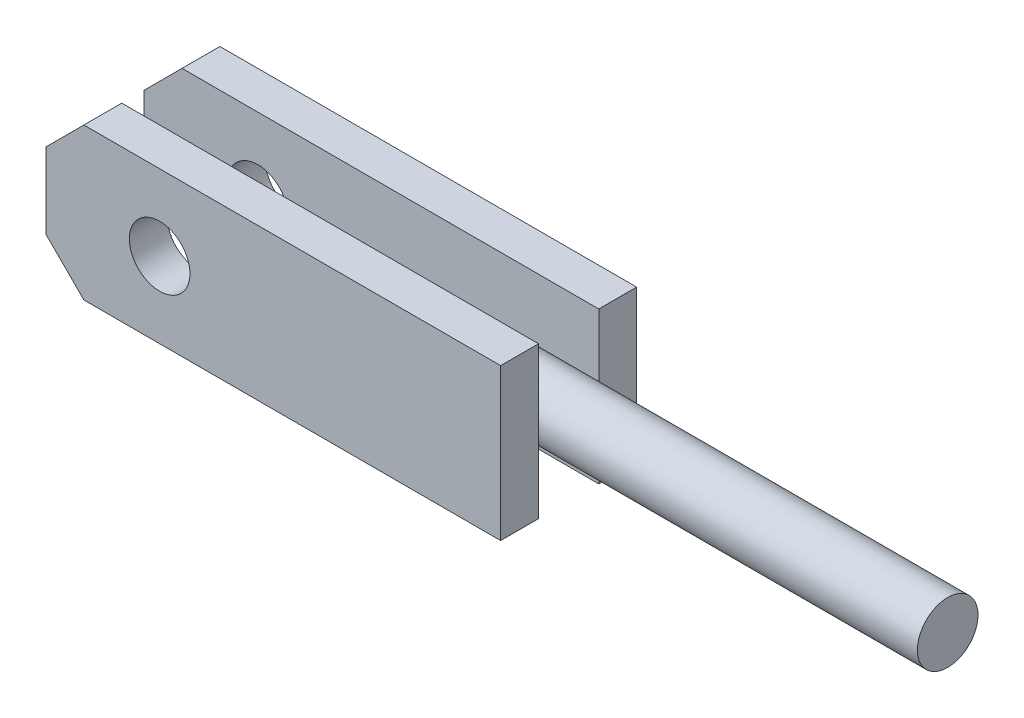
ISO-10303-21;
HEADER;
FILE_DESCRIPTION(('STEP AP214'),'2;1');
FILE_NAME('part.step','',(''),(''),'','','');
FILE_SCHEMA(('AUTOMOTIVE_DESIGN { 1 0 10303 214 1 1 1 1 }'));
ENDSEC;
DATA;
#1=APPLICATION_CONTEXT('core data for automotive mechanical design processes');
#2=APPLICATION_PROTOCOL_DEFINITION('international standard','automotive_design',2000,#1);
#3=PRODUCT_CONTEXT('',#1,'mechanical');
#4=PRODUCT('Part','Part','',(#3));
#5=PRODUCT_RELATED_PRODUCT_CATEGORY('part','',(#4));
#6=PRODUCT_DEFINITION_FORMATION('','',#4);
#7=PRODUCT_DEFINITION_CONTEXT('part definition',#1,'design');
#8=PRODUCT_DEFINITION('design','',#6,#7);
#9=PRODUCT_DEFINITION_SHAPE('','',#8);
#10=(LENGTH_UNIT() NAMED_UNIT(*) SI_UNIT(.MILLI.,.METRE.));
#11=(NAMED_UNIT(*) PLANE_ANGLE_UNIT() SI_UNIT($,.RADIAN.));
#12=(NAMED_UNIT(*) SI_UNIT($,.STERADIAN.) SOLID_ANGLE_UNIT());
#13=UNCERTAINTY_MEASURE_WITH_UNIT(LENGTH_MEASURE(1.E-05),#10,'distance_accuracy_value','');
#14=(GEOMETRIC_REPRESENTATION_CONTEXT(3) GLOBAL_UNCERTAINTY_ASSIGNED_CONTEXT((#13)) GLOBAL_UNIT_ASSIGNED_CONTEXT((#10,
#11,#12)) REPRESENTATION_CONTEXT('',''));
#15=CARTESIAN_POINT('',(0.,0.,0.));
#16=DIRECTION('',(0.,0.,1.));
#17=DIRECTION('',(1.,0.,0.));
#18=AXIS2_PLACEMENT_3D('',#15,#16,#17);
#19=CARTESIAN_POINT('',(39.9999999999998,-3.88578058618805E-13,-7.99999999999912));
#20=DIRECTION('',(1.,0.,0.));
#21=DIRECTION('',(0.,0.,-0.999999999999999));
#22=AXIS2_PLACEMENT_3D('',#19,#20,#21);
#23=CYLINDRICAL_SURFACE('',#22,8.);
#24=DIRECTION('',(1.,0.,0.));
#25=VECTOR('',#24,1.);
#26=CARTESIAN_POINT('',(39.9999999999995,-1.2609520212927,-15.8999999999991));
#27=LINE('',#26,#25);
#28=CARTESIAN_POINT('',(60.0000000000004,-1.26095202129178,-15.9));
#29=VERTEX_POINT('',#28);
#30=CARTESIAN_POINT('',(39.9999999999995,-1.2609520212927,-15.8999999999991));
#31=VERTEX_POINT('',#30);
#32=EDGE_CURVE('E153',#29,#31,#27,.F.);
#33=ORIENTED_EDGE('',*,*,#32,.F.);
#34=CARTESIAN_POINT('',(60.0000000000012,0.,-8.00000000000001));
#35=DIRECTION('',(-1.,0.,0.));
#36=DIRECTION('',(0.,0.,0.999999999999999));
#37=AXIS2_PLACEMENT_3D('',#34,#35,#36);
#38=CIRCLE('',#37,8.);
#39=CARTESIAN_POINT('',(60.0000000000004,1.26095202129145,-15.9));
#40=VERTEX_POINT('',#39);
#41=EDGE_CURVE('E134',#29,#40,#38,.F.);
#42=ORIENTED_EDGE('',*,*,#41,.T.);
#43=DIRECTION('',(1.,0.,0.));
#44=VECTOR('',#43,1.);
#45=CARTESIAN_POINT('',(39.9999999999998,1.26095202129232,-15.8999999999991));
#46=LINE('',#45,#44);
#47=CARTESIAN_POINT('',(39.9999999999998,1.26095202129232,-15.8999999999991));
#48=VERTEX_POINT('',#47);
#49=EDGE_CURVE('E128',#48,#40,#46,.T.);
#50=ORIENTED_EDGE('',*,*,#49,.F.);
#51=CARTESIAN_POINT('',(39.9999999999998,-3.88578058618805E-13,-7.99999999999912));
#52=DIRECTION('',(1.,0.,0.));
#53=DIRECTION('',(0.,0.,-0.999999999999999));
#54=AXIS2_PLACEMENT_3D('',#51,#52,#53);
#55=CIRCLE('',#54,8.);
#56=EDGE_CURVE('E158',#48,#31,#55,.T.);
#57=ORIENTED_EDGE('',*,*,#56,.T.);
#58=EDGE_LOOP('',(#33,#42,#50,#57));
#59=FACE_BOUND('',#58,.T.);
#60=CARTESIAN_POINT('',(160.000000000001,-9.08995101411847E-13,-7.99999999999779));
#61=DIRECTION('',(1.,0.,0.));
#62=DIRECTION('',(0.,0.,-0.999999999999999));
#63=AXIS2_PLACEMENT_3D('',#60,#61,#62);
#64=CIRCLE('',#63,8.);
#65=CARTESIAN_POINT('',(160.000000000001,-9.08995101411847E-13,-15.9999999999978));
#66=VERTEX_POINT('',#65);
#67=EDGE_CURVE('E155',#66,#66,#64,.T.);
#68=ORIENTED_EDGE('',*,*,#67,.F.);
#69=EDGE_LOOP('',(#68));
#70=FACE_BOUND('',#69,.T.);
#71=ADVANCED_FACE('F44',(#59,#70),#23,.T.);
#72=CARTESIAN_POINT('',(39.9999999999998,-3.88578058618805E-13,-7.99999999999912));
#73=DIRECTION('',(1.,0.,0.));
#74=DIRECTION('',(0.,0.,-0.999999999999999));
#75=AXIS2_PLACEMENT_3D('',#72,#73,#74);
#76=PLANE('',#75);
#77=ORIENTED_EDGE('',*,*,#56,.F.);
#78=DIRECTION('',(0.,-1.,0.));
#79=VECTOR('',#78,1.);
#80=CARTESIAN_POINT('',(39.9999999999994,-3.60822483003176E-13,-15.8999999999991));
#81=LINE('',#80,#79);
#82=EDGE_CURVE('E161',#48,#31,#81,.T.);
#83=ORIENTED_EDGE('',*,*,#82,.T.);
#84=EDGE_LOOP('',(#77,#83));
#85=FACE_BOUND('',#84,.T.);
#86=ADVANCED_FACE('F208',(#85),#76,.F.);
#87=CARTESIAN_POINT('',(160.000000000001,-9.08995101411847E-13,-7.99999999999779));
#88=DIRECTION('',(1.,0.,0.));
#89=DIRECTION('',(0.,0.,-0.999999999999999));
#90=AXIS2_PLACEMENT_3D('',#87,#88,#89);
#91=PLANE('',#90);
#92=ORIENTED_EDGE('',*,*,#67,.T.);
#93=EDGE_LOOP('',(#92));
#94=FACE_BOUND('',#93,.T.);
#95=ADVANCED_FACE('F214',(#94),#91,.T.);
#96=CARTESIAN_POINT('',(-59.9999999999998,-20.0000000000009,-15.8999999999996));
#97=DIRECTION('',(1.,0.,0.));
#98=DIRECTION('',(0.,1.,0.));
#99=AXIS2_PLACEMENT_3D('',#96,#97,#98);
#100=PLANE('',#99);
#101=DIRECTION('',(0.,-1.,0.));
#102=VECTOR('',#101,1.);
#103=CARTESIAN_POINT('',(-60.0000000000004,-20.000000000001,-25.8999999999996));
#104=LINE('',#103,#102);
#105=CARTESIAN_POINT('',(-60.0000000000001,9.9999999999993,-25.8999999999996));
#106=VERTEX_POINT('',#105);
#107=CARTESIAN_POINT('',(-60.0000000000003,-10.0000000000002,-25.8999999999998));
#108=VERTEX_POINT('',#107);
#109=EDGE_CURVE('E141',#106,#108,#104,.T.);
#110=ORIENTED_EDGE('',*,*,#109,.T.);
#111=DIRECTION('',(0.,0.,0.999999999999999));
#112=VECTOR('',#111,1.);
#113=CARTESIAN_POINT('',(-59.9999999999999,-10.0000000000002,-15.8999999999998));
#114=LINE('',#113,#112);
#115=CARTESIAN_POINT('',(-59.9999999999999,-10.0000000000002,-15.8999999999998));
#116=VERTEX_POINT('',#115);
#117=EDGE_CURVE('E52',#108,#116,#114,.T.);
#118=ORIENTED_EDGE('',*,*,#117,.T.);
#119=DIRECTION('',(0.,-1.,0.));
#120=VECTOR('',#119,1.);
#121=CARTESIAN_POINT('',(-59.9999999999998,-20.0000000000009,-15.8999999999996));
#122=LINE('',#121,#120);
#123=CARTESIAN_POINT('',(-59.9999999999997,9.99999999999983,-15.8999999999996));
#124=VERTEX_POINT('',#123);
#125=EDGE_CURVE('E120',#124,#116,#122,.T.);
#126=ORIENTED_EDGE('',*,*,#125,.F.);
#127=DIRECTION('',(0.,0.,-0.999999999999999));
#128=VECTOR('',#127,1.);
#129=CARTESIAN_POINT('',(-59.9999999999997,9.99999999999983,-15.8999999999996));
#130=LINE('',#129,#128);
#131=EDGE_CURVE('E165',#124,#106,#130,.T.);
#132=ORIENTED_EDGE('',*,*,#131,.T.);
#133=EDGE_LOOP('',(#110,#118,#126,#132));
#134=FACE_BOUND('',#133,.T.);
#135=ADVANCED_FACE('F188',(#134),#100,.F.);
#136=CARTESIAN_POINT('',(60.0000000000004,-19.9999999999995,-15.8999999999987));
#137=DIRECTION('',(0.,1.,0.));
#138=DIRECTION('',(-1.,0.,0.));
#139=AXIS2_PLACEMENT_3D('',#136,#137,#138);
#140=PLANE('',#139);
#141=DIRECTION('',(1.,0.,0.));
#142=VECTOR('',#141,1.);
#143=CARTESIAN_POINT('',(60.0000000000004,-19.9999999999995,-15.8999999999987));
#144=LINE('',#143,#142);
#145=CARTESIAN_POINT('',(-50.0000000000003,-19.9999999999991,-15.9));
#146=VERTEX_POINT('',#145);
#147=CARTESIAN_POINT('',(60.0000000000004,-19.9999999999995,-15.8999999999987));
#148=VERTEX_POINT('',#147);
#149=EDGE_CURVE('E109',#146,#148,#144,.T.);
#150=ORIENTED_EDGE('',*,*,#149,.F.);
#151=DIRECTION('',(0.,0.,-0.999999999999999));
#152=VECTOR('',#151,1.);
#153=CARTESIAN_POINT('',(-50.0000000000003,-19.9999999999991,-15.9));
#154=LINE('',#153,#152);
#155=CARTESIAN_POINT('',(-50.0000000000005,-19.9999999999996,-25.9));
#156=VERTEX_POINT('',#155);
#157=EDGE_CURVE('E174',#146,#156,#154,.T.);
#158=ORIENTED_EDGE('',*,*,#157,.T.);
#159=DIRECTION('',(1.,0.,0.));
#160=VECTOR('',#159,1.);
#161=CARTESIAN_POINT('',(60.0000000000012,-20.,-25.8999999999987));
#162=LINE('',#161,#160);
#163=CARTESIAN_POINT('',(60.0000000000012,-20.,-25.8999999999987));
#164=VERTEX_POINT('',#163);
#165=EDGE_CURVE('E125',#156,#164,#162,.T.);
#166=ORIENTED_EDGE('',*,*,#165,.T.);
#167=DIRECTION('',(0.,0.,-0.999999999999999));
#168=VECTOR('',#167,1.);
#169=CARTESIAN_POINT('',(60.0000000000004,-19.9999999999995,-15.8999999999987));
#170=LINE('',#169,#168);
#171=EDGE_CURVE('E123',#148,#164,#170,.T.);
#172=ORIENTED_EDGE('',*,*,#171,.F.);
#173=EDGE_LOOP('',(#150,#158,#166,#172));
#174=FACE_BOUND('',#173,.T.);
#175=ADVANCED_FACE('F124',(#174),#140,.F.);
#176=CARTESIAN_POINT('',(60.0000000000004,-19.9999999999995,-15.8999999999987));
#177=DIRECTION('',(-1.,0.,0.));
#178=DIRECTION('',(0.,0.,0.999999999999999));
#179=AXIS2_PLACEMENT_3D('',#176,#177,#178);
#180=PLANE('',#179);
#181=ORIENTED_EDGE('',*,*,#41,.F.);
#182=DIRECTION('',(0.,1.,0.));
#183=VECTOR('',#182,1.);
#184=CARTESIAN_POINT('',(60.0000000000004,-19.9999999999995,-15.8999999999987));
#185=LINE('',#184,#183);
#186=EDGE_CURVE('E113',#148,#29,#185,.T.);
#187=ORIENTED_EDGE('',*,*,#186,.F.);
#188=ORIENTED_EDGE('',*,*,#171,.T.);
#189=DIRECTION('',(0.,1.,0.));
#190=VECTOR('',#189,1.);
#191=CARTESIAN_POINT('',(60.0000000000012,-20.,-25.8999999999987));
#192=LINE('',#191,#190);
#193=CARTESIAN_POINT('',(60.,19.9999999999991,-25.9000000000005));
#194=VERTEX_POINT('',#193);
#195=EDGE_CURVE('E145',#164,#194,#192,.T.);
#196=ORIENTED_EDGE('',*,*,#195,.T.);
#197=DIRECTION('',(0.,0.,-0.999999999999999));
#198=VECTOR('',#197,1.);
#199=CARTESIAN_POINT('',(59.9999999999996,19.9999999999991,-15.9000000000005));
#200=LINE('',#199,#198);
#201=CARTESIAN_POINT('',(59.9999999999996,19.9999999999991,-15.9000000000005));
#202=VERTEX_POINT('',#201);
#203=EDGE_CURVE('E129',#202,#194,#200,.T.);
#204=ORIENTED_EDGE('',*,*,#203,.F.);
#205=EDGE_CURVE('E119',#40,#202,#185,.T.);
#206=ORIENTED_EDGE('',*,*,#205,.F.);
#207=EDGE_LOOP('',(#181,#187,#188,#196,#204,#206));
#208=FACE_BOUND('',#207,.T.);
#209=ADVANCED_FACE('F131',(#208),#180,.F.);
#210=CARTESIAN_POINT('',(59.9999999999996,19.9999999999991,-15.9000000000005));
#211=DIRECTION('',(0.,-1.,0.));
#212=DIRECTION('',(1.,0.,0.));
#213=AXIS2_PLACEMENT_3D('',#210,#211,#212);
#214=PLANE('',#213);
#215=DIRECTION('',(-1.,0.,0.));
#216=VECTOR('',#215,1.);
#217=CARTESIAN_POINT('',(60.,19.9999999999991,-25.9000000000005));
#218=LINE('',#217,#216);
#219=CARTESIAN_POINT('',(-50.0000000000005,20.0000000000005,-25.9000000000003));
#220=VERTEX_POINT('',#219);
#221=EDGE_CURVE('E147',#194,#220,#218,.T.);
#222=ORIENTED_EDGE('',*,*,#221,.T.);
#223=DIRECTION('',(0.,0.,0.999999999999999));
#224=VECTOR('',#223,1.);
#225=CARTESIAN_POINT('',(-50.0000000000001,19.9999999999996,-15.9000000000002));
#226=LINE('',#225,#224);
#227=CARTESIAN_POINT('',(-50.0000000000001,19.9999999999996,-15.9000000000002));
#228=VERTEX_POINT('',#227);
#229=EDGE_CURVE('E170',#220,#228,#226,.T.);
#230=ORIENTED_EDGE('',*,*,#229,.T.);
#231=DIRECTION('',(-1.,0.,0.));
#232=VECTOR('',#231,1.);
#233=CARTESIAN_POINT('',(59.9999999999996,19.9999999999991,-15.9000000000005));
#234=LINE('',#233,#232);
#235=EDGE_CURVE('E135',#202,#228,#234,.T.);
#236=ORIENTED_EDGE('',*,*,#235,.F.);
#237=ORIENTED_EDGE('',*,*,#203,.T.);
#238=EDGE_LOOP('',(#222,#230,#236,#237));
#239=FACE_BOUND('',#238,.T.);
#240=ADVANCED_FACE('F182',(#239),#214,.F.);
#241=CARTESIAN_POINT('',(-5.55111512312578E-13,-3.33066907387547E-13,-15.9));
#242=DIRECTION('',(0.,0.,0.999999999999999));
#243=DIRECTION('',(1.,0.,0.));
#244=AXIS2_PLACEMENT_3D('',#241,#242,#243);
#245=PLANE('',#244);
#246=CARTESIAN_POINT('',(-30.0000000000001,0.,-15.8999999999996));
#247=DIRECTION('',(0.,0.,0.999999999999999));
#248=DIRECTION('',(1.,0.,0.));
#249=AXIS2_PLACEMENT_3D('',#246,#247,#248);
#250=CIRCLE('',#249,8.);
#251=CARTESIAN_POINT('',(-38.,0.,-15.8999999999996));
#252=VERTEX_POINT('',#251);
#253=EDGE_CURVE('E143',#252,#252,#250,.T.);
#254=ORIENTED_EDGE('',*,*,#253,.F.);
#255=EDGE_LOOP('',(#254));
#256=FACE_BOUND('',#255,.T.);
#257=ORIENTED_EDGE('',*,*,#125,.T.);
#258=DIRECTION('',(-0.707106781186547,0.707106781186549,0.));
#259=VECTOR('',#258,1.);
#260=CARTESIAN_POINT('',(-35.0000000000003,-35.0000000000001,-15.9));
#261=LINE('',#260,#259);
#262=EDGE_CURVE('E12',#116,#146,#261,.F.);
#263=ORIENTED_EDGE('',*,*,#262,.T.);
#264=ORIENTED_EDGE('',*,*,#149,.T.);
#265=ORIENTED_EDGE('',*,*,#186,.T.);
#266=ORIENTED_EDGE('',*,*,#32,.T.);
#267=ORIENTED_EDGE('',*,*,#82,.F.);
#268=ORIENTED_EDGE('',*,*,#49,.T.);
#269=ORIENTED_EDGE('',*,*,#205,.T.);
#270=ORIENTED_EDGE('',*,*,#235,.T.);
#271=DIRECTION('',(0.707106781186548,0.707106781186547,0.));
#272=VECTOR('',#271,1.);
#273=CARTESIAN_POINT('',(-35.0000000000006,34.9999999999984,-15.8999999999996));
#274=LINE('',#273,#272);
#275=EDGE_CURVE('E172',#228,#124,#274,.F.);
#276=ORIENTED_EDGE('',*,*,#275,.T.);
#277=EDGE_LOOP('',(#257,#263,#264,#265,#266,#267,#268,#269,#270,#276));
#278=FACE_BOUND('',#277,.T.);
#279=ADVANCED_FACE('F111',(#256,#278),#245,.T.);
#280=CARTESIAN_POINT('',(2.22044604925031E-13,9.0205620750794E-13,-25.9));
#281=DIRECTION('',(0.,0.,0.999999999999999));
#282=DIRECTION('',(1.,0.,0.));
#283=AXIS2_PLACEMENT_3D('',#280,#281,#282);
#284=PLANE('',#283);
#285=CARTESIAN_POINT('',(-30.0000000000003,-4.16333634234434E-13,-25.8999999999996));
#286=DIRECTION('',(0.,0.,-0.999999999999999));
#287=DIRECTION('',(-1.,0.,0.));
#288=AXIS2_PLACEMENT_3D('',#285,#286,#287);
#289=CIRCLE('',#288,8.);
#290=CARTESIAN_POINT('',(-38.,0.,-25.8999999999996));
#291=VERTEX_POINT('',#290);
#292=EDGE_CURVE('E192',#291,#291,#289,.T.);
#293=ORIENTED_EDGE('',*,*,#292,.F.);
#294=EDGE_LOOP('',(#293));
#295=FACE_BOUND('',#294,.T.);
#296=ORIENTED_EDGE('',*,*,#165,.F.);
#297=DIRECTION('',(0.707106781186547,-0.707106781186549,0.));
#298=VECTOR('',#297,1.);
#299=CARTESIAN_POINT('',(-50.0000000000013,-19.9999999999996,-25.9));
#300=LINE('',#299,#298);
#301=EDGE_CURVE('E66',#156,#108,#300,.F.);
#302=ORIENTED_EDGE('',*,*,#301,.T.);
#303=ORIENTED_EDGE('',*,*,#109,.F.);
#304=DIRECTION('',(-0.707106781186548,-0.707106781186547,0.));
#305=VECTOR('',#304,1.);
#306=CARTESIAN_POINT('',(-60.0000000000001,9.9999999999993,-25.8999999999996));
#307=LINE('',#306,#305);
#308=EDGE_CURVE('E168',#106,#220,#307,.F.);
#309=ORIENTED_EDGE('',*,*,#308,.T.);
#310=ORIENTED_EDGE('',*,*,#221,.F.);
#311=ORIENTED_EDGE('',*,*,#195,.F.);
#312=EDGE_LOOP('',(#296,#302,#303,#309,#310,#311));
#313=FACE_BOUND('',#312,.T.);
#314=ADVANCED_FACE('F177',(#295,#313),#284,.F.);
#315=CARTESIAN_POINT('',(-59.9999999999997,9.99999999999983,-15.8999999999996));
#316=DIRECTION('',(0.707106781186547,-0.707106781186548,0.));
#317=DIRECTION('',(0.,0.,-0.999999999999999));
#318=AXIS2_PLACEMENT_3D('',#315,#316,#317);
#319=PLANE('',#318);
#320=ORIENTED_EDGE('',*,*,#275,.F.);
#321=ORIENTED_EDGE('',*,*,#229,.F.);
#322=ORIENTED_EDGE('',*,*,#308,.F.);
#323=ORIENTED_EDGE('',*,*,#131,.F.);
#324=EDGE_LOOP('',(#320,#321,#322,#323));
#325=FACE_BOUND('',#324,.T.);
#326=ADVANCED_FACE('F187',(#325),#319,.F.);
#327=CARTESIAN_POINT('',(-50.0000000000003,-19.9999999999991,-15.9));
#328=DIRECTION('',(0.707106781186549,0.707106781186547,0.));
#329=DIRECTION('',(0.,0.,-0.999999999999999));
#330=AXIS2_PLACEMENT_3D('',#327,#328,#329);
#331=PLANE('',#330);
#332=ORIENTED_EDGE('',*,*,#262,.F.);
#333=ORIENTED_EDGE('',*,*,#117,.F.);
#334=ORIENTED_EDGE('',*,*,#301,.F.);
#335=ORIENTED_EDGE('',*,*,#157,.F.);
#336=EDGE_LOOP('',(#332,#333,#334,#335));
#337=FACE_BOUND('',#336,.T.);
#338=ADVANCED_FACE('F46',(#337),#331,.F.);
#339=CARTESIAN_POINT('',(-30.,0.,74.1000000000001));
#340=DIRECTION('',(0.,0.,-0.999999999999999));
#341=DIRECTION('',(-1.,0.,0.));
#342=AXIS2_PLACEMENT_3D('',#339,#340,#341);
#343=CYLINDRICAL_SURFACE('',#342,8.);
#344=CARTESIAN_POINT('',(-38.,0.,-15.8999999999996));
#345=CARTESIAN_POINT('',(-38.,0.,-16.0041666666663));
#346=CARTESIAN_POINT('',(-38.,0.,-16.1083333333329));
#347=CARTESIAN_POINT('',(-38.,0.,-16.3166666666663));
#348=CARTESIAN_POINT('',(-38.,0.,-16.4208333333329));
#349=CARTESIAN_POINT('',(-38.,0.,-16.6291666666663));
#350=CARTESIAN_POINT('',(-38.,0.,-16.7333333333329));
#351=CARTESIAN_POINT('',(-38.,0.,-16.9416666666663));
#352=CARTESIAN_POINT('',(-38.,0.,-17.0458333333329));
#353=CARTESIAN_POINT('',(-38.,0.,-17.2541666666663));
#354=CARTESIAN_POINT('',(-38.,0.,-17.3583333333329));
#355=CARTESIAN_POINT('',(-38.,0.,-17.5666666666663));
#356=CARTESIAN_POINT('',(-38.,0.,-17.6708333333329));
#357=CARTESIAN_POINT('',(-38.,0.,-17.8791666666663));
#358=CARTESIAN_POINT('',(-38.,0.,-17.9833333333329));
#359=CARTESIAN_POINT('',(-38.,0.,-18.1916666666663));
#360=CARTESIAN_POINT('',(-38.,0.,-18.2958333333329));
#361=CARTESIAN_POINT('',(-38.,0.,-18.5041666666663));
#362=CARTESIAN_POINT('',(-38.,0.,-18.6083333333329));
#363=CARTESIAN_POINT('',(-38.,0.,-18.8166666666663));
#364=CARTESIAN_POINT('',(-38.,0.,-18.9208333333329));
#365=CARTESIAN_POINT('',(-38.,0.,-19.1291666666663));
#366=CARTESIAN_POINT('',(-38.,0.,-19.2333333333329));
#367=CARTESIAN_POINT('',(-38.,0.,-19.4416666666663));
#368=CARTESIAN_POINT('',(-38.,0.,-19.5458333333329));
#369=CARTESIAN_POINT('',(-38.,0.,-19.7541666666663));
#370=CARTESIAN_POINT('',(-38.,0.,-19.8583333333329));
#371=CARTESIAN_POINT('',(-38.,0.,-20.0666666666662));
#372=CARTESIAN_POINT('',(-38.,0.,-20.1708333333329));
#373=CARTESIAN_POINT('',(-38.,0.,-20.3791666666663));
#374=CARTESIAN_POINT('',(-38.,0.,-20.4833333333329));
#375=CARTESIAN_POINT('',(-38.,0.,-20.6916666666663));
#376=CARTESIAN_POINT('',(-38.,0.,-20.7958333333329));
#377=CARTESIAN_POINT('',(-38.,0.,-21.0041666666663));
#378=CARTESIAN_POINT('',(-38.,0.,-21.1083333333329));
#379=CARTESIAN_POINT('',(-38.,0.,-21.3166666666662));
#380=CARTESIAN_POINT('',(-38.,0.,-21.4208333333329));
#381=CARTESIAN_POINT('',(-38.,0.,-21.6291666666663));
#382=CARTESIAN_POINT('',(-38.,0.,-21.7333333333329));
#383=CARTESIAN_POINT('',(-38.,0.,-21.9416666666663));
#384=CARTESIAN_POINT('',(-38.,0.,-22.0458333333329));
#385=CARTESIAN_POINT('',(-38.,0.,-22.2541666666663));
#386=CARTESIAN_POINT('',(-38.,0.,-22.3583333333329));
#387=CARTESIAN_POINT('',(-38.,0.,-22.5666666666663));
#388=CARTESIAN_POINT('',(-38.,0.,-22.6708333333329));
#389=CARTESIAN_POINT('',(-38.,0.,-22.8791666666663));
#390=CARTESIAN_POINT('',(-38.,0.,-22.9833333333329));
#391=CARTESIAN_POINT('',(-38.,0.,-23.1916666666663));
#392=CARTESIAN_POINT('',(-38.,0.,-23.2958333333329));
#393=CARTESIAN_POINT('',(-38.,0.,-23.5041666666663));
#394=CARTESIAN_POINT('',(-38.,0.,-23.6083333333329));
#395=CARTESIAN_POINT('',(-38.,0.,-23.8166666666663));
#396=CARTESIAN_POINT('',(-38.,0.,-23.9208333333329));
#397=CARTESIAN_POINT('',(-38.,0.,-24.1291666666663));
#398=CARTESIAN_POINT('',(-38.,0.,-24.2333333333329));
#399=CARTESIAN_POINT('',(-38.,0.,-24.4416666666663));
#400=CARTESIAN_POINT('',(-38.,0.,-24.5458333333329));
#401=CARTESIAN_POINT('',(-38.,0.,-24.7541666666663));
#402=CARTESIAN_POINT('',(-38.,0.,-24.8583333333329));
#403=CARTESIAN_POINT('',(-38.,0.,-25.0666666666663));
#404=CARTESIAN_POINT('',(-38.,0.,-25.1708333333329));
#405=CARTESIAN_POINT('',(-38.,0.,-25.3791666666663));
#406=CARTESIAN_POINT('',(-38.,0.,-25.4833333333329));
#407=CARTESIAN_POINT('',(-38.,0.,-25.6916666666663));
#408=CARTESIAN_POINT('',(-38.,0.,-25.7958333333329));
#409=CARTESIAN_POINT('',(-38.,0.,-25.8999999999996));
#410=B_SPLINE_CURVE_WITH_KNOTS('',3,(#344,#345,#346,#347,#348,#349,#350,#351,#352,#353,#354,
#355,#356,#357,#358,#359,#360,#361,#362,#363,#364,#365,#366,#367,#368,#369,#370,#371,#372,#373,
#374,#375,#376,#377,#378,#379,#380,#381,#382,#383,#384,#385,#386,#387,#388,#389,#390,#391,#392,
#393,#394,#395,#396,#397,#398,#399,#400,#401,#402,#403,#404,#405,#406,#407,#408,#409),
.UNSPECIFIED.,.F.,.F.,(4,2,2,2,2,2,2,2,2,2,2,2,2,2,2,2,2,2,2,2,2,2,2,2,2,2,2,2,2,2,2,2,4),(0.,
0.312499999999993,0.625000000000001,0.937500000000008,1.25,1.56249999999999,1.875,
2.18750000000001,2.5,2.8125,3.125,3.43750000000001,3.75,4.06249999999998,4.37499999999999,
4.6875,4.99999999999999,5.31249999999998,5.62499999999999,5.9375,6.24999999999999,
6.56249999999998,6.87499999999999,7.1875,7.49999999999999,7.81249999999999,8.12499999999999,
8.4375,8.74999999999999,9.06249999999999,9.37499999999999,9.6875,9.99999999999999),.UNSPECIFIED.);
#411=EDGE_CURVE('BSEAM196',#252,#291,#410,.T.);
#412=ORIENTED_EDGE('',*,*,#253,.T.);
#413=ORIENTED_EDGE('',*,*,#292,.T.);
#414=ORIENTED_EDGE('',*,*,#411,.T.);
#415=ORIENTED_EDGE('',*,*,#411,.F.);
#416=EDGE_LOOP('',(#412,#414,#413,#415));
#417=FACE_BOUND('',#416,.T.);
#418=ADVANCED_FACE('F196',(#417),#343,.F.);
#419=CLOSED_SHELL('',(#71,#86,#95,#135,#175,#209,#240,#279,#314,#326,#338,#418));
#420=MANIFOLD_SOLID_BREP('B2',#419);
#421=CARTESIAN_POINT('',(-59.9999999999991,-20.0000000000009,10.0000000000005));
#422=DIRECTION('',(1.,0.,0.));
#423=DIRECTION('',(0.,1.,0.));
#424=AXIS2_PLACEMENT_3D('',#421,#422,#423);
#425=PLANE('',#424);
#426=DIRECTION('',(0.,-1.,0.));
#427=VECTOR('',#426,1.);
#428=CARTESIAN_POINT('',(-59.9999999999994,-20.0000000000009,4.44089209850063E-13));
#429=LINE('',#428,#427);
#430=CARTESIAN_POINT('',(-59.9999999999989,9.99999999999986,4.44089209850063E-13));
#431=VERTEX_POINT('',#430);
#432=CARTESIAN_POINT('',(-59.9999999999998,-10.0000000000015,0.));
#433=VERTEX_POINT('',#432);
#434=EDGE_CURVE('E364',#431,#433,#429,.T.);
#435=ORIENTED_EDGE('',*,*,#434,.T.);
#436=DIRECTION('',(0.,0.,0.999999999999999));
#437=VECTOR('',#436,1.);
#438=CARTESIAN_POINT('',(-59.9999999999998,-10.0000000000016,10.));
#439=LINE('',#438,#437);
#440=CARTESIAN_POINT('',(-59.9999999999998,-10.0000000000016,10.));
#441=VERTEX_POINT('',#440);
#442=EDGE_CURVE('E290',#433,#441,#439,.T.);
#443=ORIENTED_EDGE('',*,*,#442,.T.);
#444=DIRECTION('',(0.,-1.,0.));
#445=VECTOR('',#444,1.);
#446=CARTESIAN_POINT('',(-59.9999999999991,-20.0000000000009,10.0000000000005));
#447=LINE('',#446,#445);
#448=CARTESIAN_POINT('',(-59.9999999999987,9.99999999999976,10.0000000000005));
#449=VERTEX_POINT('',#448);
#450=EDGE_CURVE('E345',#449,#441,#447,.T.);
#451=ORIENTED_EDGE('',*,*,#450,.F.);
#452=DIRECTION('',(0.,0.,-0.999999999999999));
#453=VECTOR('',#452,1.);
#454=CARTESIAN_POINT('',(-59.9999999999987,9.99999999999976,10.0000000000005));
#455=LINE('',#454,#453);
#456=EDGE_CURVE('E353',#449,#431,#455,.T.);
#457=ORIENTED_EDGE('',*,*,#456,.T.);
#458=EDGE_LOOP('',(#435,#443,#451,#457));
#459=FACE_BOUND('',#458,.T.);
#460=ADVANCED_FACE('F282',(#459),#425,.F.);
#461=CARTESIAN_POINT('',(60.0000000000012,-20.,10.0000000000013));
#462=DIRECTION('',(0.,1.,0.));
#463=DIRECTION('',(-1.,0.,0.));
#464=AXIS2_PLACEMENT_3D('',#461,#462,#463);
#465=PLANE('',#464);
#466=DIRECTION('',(1.,0.,0.));
#467=VECTOR('',#466,1.);
#468=CARTESIAN_POINT('',(60.0000000000012,-20.,10.0000000000013));
#469=LINE('',#468,#467);
#470=CARTESIAN_POINT('',(-49.9999999999998,-20.0000000000005,10.));
#471=VERTEX_POINT('',#470);
#472=CARTESIAN_POINT('',(60.0000000000012,-20.,10.0000000000013));
#473=VERTEX_POINT('',#472);
#474=EDGE_CURVE('E334',#471,#473,#469,.T.);
#475=ORIENTED_EDGE('',*,*,#474,.F.);
#476=DIRECTION('',(0.,0.,-0.999999999999999));
#477=VECTOR('',#476,1.);
#478=CARTESIAN_POINT('',(-49.9999999999998,-20.0000000000005,10.));
#479=LINE('',#478,#477);
#480=CARTESIAN_POINT('',(-49.9999999999997,-19.9999999999999,0.));
#481=VERTEX_POINT('',#480);
#482=EDGE_CURVE('E382',#471,#481,#479,.T.);
#483=ORIENTED_EDGE('',*,*,#482,.T.);
#484=DIRECTION('',(1.,0.,0.));
#485=VECTOR('',#484,1.);
#486=CARTESIAN_POINT('',(60.0000000000012,-20.0000000000004,1.33226762955019E-12));
#487=LINE('',#486,#485);
#488=CARTESIAN_POINT('',(60.0000000000012,-20.0000000000004,1.33226762955019E-12));
#489=VERTEX_POINT('',#488);
#490=EDGE_CURVE('E350',#481,#489,#487,.T.);
#491=ORIENTED_EDGE('',*,*,#490,.T.);
#492=DIRECTION('',(0.,0.,-0.999999999999999));
#493=VECTOR('',#492,1.);
#494=CARTESIAN_POINT('',(60.0000000000012,-20.,10.0000000000013));
#495=LINE('',#494,#493);
#496=EDGE_CURVE('E348',#473,#489,#495,.T.);
#497=ORIENTED_EDGE('',*,*,#496,.F.);
#498=EDGE_LOOP('',(#475,#483,#491,#497));
#499=FACE_BOUND('',#498,.T.);
#500=ADVANCED_FACE('F349',(#499),#465,.F.);
#501=CARTESIAN_POINT('',(60.0000000000012,-20.,10.0000000000013));
#502=DIRECTION('',(-1.,0.,0.));
#503=DIRECTION('',(0.,0.,0.999999999999999));
#504=AXIS2_PLACEMENT_3D('',#501,#502,#503);
#505=PLANE('',#504);
#506=DIRECTION('',(0.,1.,0.));
#507=VECTOR('',#506,1.);
#508=CARTESIAN_POINT('',(60.0000000000012,-20.0000000000004,1.33226762955019E-12));
#509=LINE('',#508,#507);
#510=CARTESIAN_POINT('',(60.0000000000003,19.9999999999992,-4.44089209850063E-13));
#511=VERTEX_POINT('',#510);
#512=EDGE_CURVE('E368',#489,#511,#509,.T.);
#513=ORIENTED_EDGE('',*,*,#512,.T.);
#514=DIRECTION('',(0.,0.,-0.999999999999999));
#515=VECTOR('',#514,1.);
#516=CARTESIAN_POINT('',(59.9999999999995,19.9999999999991,9.99999999999956));
#517=LINE('',#516,#515);
#518=CARTESIAN_POINT('',(59.9999999999995,19.9999999999991,9.99999999999956));
#519=VERTEX_POINT('',#518);
#520=EDGE_CURVE('E354',#519,#511,#517,.T.);
#521=ORIENTED_EDGE('',*,*,#520,.F.);
#522=DIRECTION('',(0.,1.,0.));
#523=VECTOR('',#522,1.);
#524=CARTESIAN_POINT('',(60.0000000000012,-20.,10.0000000000013));
#525=LINE('',#524,#523);
#526=EDGE_CURVE('E339',#473,#519,#525,.T.);
#527=ORIENTED_EDGE('',*,*,#526,.F.);
#528=ORIENTED_EDGE('',*,*,#496,.T.);
#529=EDGE_LOOP('',(#513,#521,#527,#528));
#530=FACE_BOUND('',#529,.T.);
#531=ADVANCED_FACE('F356',(#530),#505,.F.);
#532=CARTESIAN_POINT('',(59.9999999999995,19.9999999999991,9.99999999999956));
#533=DIRECTION('',(0.,-1.,0.));
#534=DIRECTION('',(1.,0.,0.));
#535=AXIS2_PLACEMENT_3D('',#532,#533,#534);
#536=PLANE('',#535);
#537=DIRECTION('',(-1.,0.,0.));
#538=VECTOR('',#537,1.);
#539=CARTESIAN_POINT('',(60.0000000000003,19.9999999999992,-4.44089209850063E-13));
#540=LINE('',#539,#538);
#541=CARTESIAN_POINT('',(-50.0000000000001,20.,-4.44089209850063E-13));
#542=VERTEX_POINT('',#541);
#543=EDGE_CURVE('E370',#511,#542,#540,.T.);
#544=ORIENTED_EDGE('',*,*,#543,.T.);
#545=DIRECTION('',(0.,0.,0.999999999999999));
#546=VECTOR('',#545,1.);
#547=CARTESIAN_POINT('',(-49.9999999999998,20.,9.99999999999956));
#548=LINE('',#547,#546);
#549=CARTESIAN_POINT('',(-49.9999999999998,20.,9.99999999999956));
#550=VERTEX_POINT('',#549);
#551=EDGE_CURVE('E378',#542,#550,#548,.T.);
#552=ORIENTED_EDGE('',*,*,#551,.T.);
#553=DIRECTION('',(-1.,0.,0.));
#554=VECTOR('',#553,1.);
#555=CARTESIAN_POINT('',(59.9999999999995,19.9999999999991,9.99999999999956));
#556=LINE('',#555,#554);
#557=EDGE_CURVE('E359',#519,#550,#556,.T.);
#558=ORIENTED_EDGE('',*,*,#557,.F.);
#559=ORIENTED_EDGE('',*,*,#520,.T.);
#560=EDGE_LOOP('',(#544,#552,#558,#559));
#561=FACE_BOUND('',#560,.T.);
#562=ADVANCED_FACE('F388',(#561),#536,.F.);
#563=CARTESIAN_POINT('',(5.55111512312578E-13,0.,10.));
#564=DIRECTION('',(0.,0.,0.999999999999999));
#565=DIRECTION('',(1.,0.,0.));
#566=AXIS2_PLACEMENT_3D('',#563,#564,#565);
#567=PLANE('',#566);
#568=CARTESIAN_POINT('',(-29.9999999999989,-4.16333634234434E-13,10.0000000000005));
#569=DIRECTION('',(0.,0.,0.999999999999999));
#570=DIRECTION('',(1.,0.,0.));
#571=AXIS2_PLACEMENT_3D('',#568,#569,#570);
#572=CIRCLE('',#571,8.);
#573=CARTESIAN_POINT('',(-21.9999999999994,-8.87290241280425E-13,10.0000000000005));
#574=VERTEX_POINT('',#573);
#575=EDGE_CURVE('E395',#574,#574,#572,.T.);
#576=ORIENTED_EDGE('',*,*,#575,.F.);
#577=EDGE_LOOP('',(#576));
#578=FACE_BOUND('',#577,.T.);
#579=ORIENTED_EDGE('',*,*,#450,.T.);
#580=DIRECTION('',(-0.707106781186547,0.70710678118655,0.));
#581=VECTOR('',#580,1.);
#582=CARTESIAN_POINT('',(-34.9999999999993,-35.0000000000011,10.));
#583=LINE('',#582,#581);
#584=EDGE_CURVE('E42',#441,#471,#583,.F.);
#585=ORIENTED_EDGE('',*,*,#584,.T.);
#586=ORIENTED_EDGE('',*,*,#474,.T.);
#587=ORIENTED_EDGE('',*,*,#526,.T.);
#588=ORIENTED_EDGE('',*,*,#557,.T.);
#589=DIRECTION('',(0.70710678118655,0.707106781186547,0.));
#590=VECTOR('',#589,1.);
#591=CARTESIAN_POINT('',(-34.9999999999992,34.9999999999993,10.0000000000005));
#592=LINE('',#591,#590);
#593=EDGE_CURVE('E380',#550,#449,#592,.F.);
#594=ORIENTED_EDGE('',*,*,#593,.T.);
#595=EDGE_LOOP('',(#579,#585,#586,#587,#588,#594));
#596=FACE_BOUND('',#595,.T.);
#597=ADVANCED_FACE('F336',(#578,#596),#567,.T.);
#598=CARTESIAN_POINT('',(0.,0.,0.));
#599=DIRECTION('',(0.,0.,0.999999999999999));
#600=DIRECTION('',(1.,0.,0.));
#601=AXIS2_PLACEMENT_3D('',#598,#599,#600);
#602=PLANE('',#601);
#603=CARTESIAN_POINT('',(-29.9999999999994,-8.88178419700125E-13,4.44089209850063E-13));
#604=DIRECTION('',(0.,0.,0.999999999999999));
#605=DIRECTION('',(1.,0.,0.));
#606=AXIS2_PLACEMENT_3D('',#603,#604,#605);
#607=CIRCLE('',#606,8.);
#608=CARTESIAN_POINT('',(-21.9999999999994,-8.87290241280425E-13,4.44089209877207E-13));
#609=VERTEX_POINT('',#608);
#610=EDGE_CURVE('E366',#609,#609,#607,.T.);
#611=ORIENTED_EDGE('',*,*,#610,.T.);
#612=EDGE_LOOP('',(#611));
#613=FACE_BOUND('',#612,.T.);
#614=ORIENTED_EDGE('',*,*,#490,.F.);
#615=DIRECTION('',(0.707106781186547,-0.70710678118655,0.));
#616=VECTOR('',#615,1.);
#617=CARTESIAN_POINT('',(-49.9999999999997,-19.9999999999999,0.));
#618=LINE('',#617,#616);
#619=EDGE_CURVE('E304',#481,#433,#618,.F.);
#620=ORIENTED_EDGE('',*,*,#619,.T.);
#621=ORIENTED_EDGE('',*,*,#434,.F.);
#622=DIRECTION('',(-0.70710678118655,-0.707106781186547,0.));
#623=VECTOR('',#622,1.);
#624=CARTESIAN_POINT('',(-59.9999999999989,9.99999999999986,4.44089209850063E-13));
#625=LINE('',#624,#623);
#626=EDGE_CURVE('E376',#431,#542,#625,.F.);
#627=ORIENTED_EDGE('',*,*,#626,.T.);
#628=ORIENTED_EDGE('',*,*,#543,.F.);
#629=ORIENTED_EDGE('',*,*,#512,.F.);
#630=EDGE_LOOP('',(#614,#620,#621,#627,#628,#629));
#631=FACE_BOUND('',#630,.T.);
#632=ADVANCED_FACE('F385',(#613,#631),#602,.F.);
#633=CARTESIAN_POINT('',(-29.9999999999994,-8.88178419700125E-13,4.44089209850063E-13));
#634=DIRECTION('',(0.,0.,0.999999999999999));
#635=DIRECTION('',(1.,0.,0.));
#636=AXIS2_PLACEMENT_3D('',#633,#634,#635);
#637=CYLINDRICAL_SURFACE('',#636,8.);
#638=CARTESIAN_POINT('',(-21.9999999999994,-8.87290241280425E-13,4.44089209877207E-13));
#639=CARTESIAN_POINT('',(-21.9999999999994,-8.87290241280425E-13,0.104166666667111));
#640=CARTESIAN_POINT('',(-21.9999999999994,-8.87290241280425E-13,0.208333333333778));
#641=CARTESIAN_POINT('',(-21.9999999999994,-8.87290241280425E-13,0.416666666667111));
#642=CARTESIAN_POINT('',(-21.9999999999994,-8.87290241280425E-13,0.520833333333778));
#643=CARTESIAN_POINT('',(-21.9999999999994,-8.87290241280425E-13,0.729166666667111));
#644=CARTESIAN_POINT('',(-21.9999999999994,-8.87290241280425E-13,0.833333333333778));
#645=CARTESIAN_POINT('',(-21.9999999999994,-8.87290241280425E-13,1.04166666666711));
#646=CARTESIAN_POINT('',(-21.9999999999994,-8.87290241280425E-13,1.14583333333378));
#647=CARTESIAN_POINT('',(-21.9999999999994,-8.87290241280425E-13,1.35416666666711));
#648=CARTESIAN_POINT('',(-21.9999999999994,-8.87290241280425E-13,1.45833333333378));
#649=CARTESIAN_POINT('',(-21.9999999999994,-8.87290241280425E-13,1.66666666666711));
#650=CARTESIAN_POINT('',(-21.9999999999994,-8.87290241280425E-13,1.77083333333378));
#651=CARTESIAN_POINT('',(-21.9999999999994,-8.87290241280425E-13,1.97916666666711));
#652=CARTESIAN_POINT('',(-21.9999999999994,-8.87290241280425E-13,2.08333333333378));
#653=CARTESIAN_POINT('',(-21.9999999999994,-8.87290241280425E-13,2.29166666666711));
#654=CARTESIAN_POINT('',(-21.9999999999994,-8.87290241280425E-13,2.39583333333378));
#655=CARTESIAN_POINT('',(-21.9999999999994,-8.87290241280425E-13,2.60416666666711));
#656=CARTESIAN_POINT('',(-21.9999999999994,-8.87290241280425E-13,2.70833333333378));
#657=CARTESIAN_POINT('',(-21.9999999999994,-8.87290241280425E-13,2.91666666666711));
#658=CARTESIAN_POINT('',(-21.9999999999994,-8.87290241280425E-13,3.02083333333378));
#659=CARTESIAN_POINT('',(-21.9999999999994,-8.87290241280425E-13,3.22916666666711));
#660=CARTESIAN_POINT('',(-21.9999999999994,-8.87290241280425E-13,3.33333333333378));
#661=CARTESIAN_POINT('',(-21.9999999999994,-8.87290241280425E-13,3.54166666666711));
#662=CARTESIAN_POINT('',(-21.9999999999994,-8.87290241280425E-13,3.64583333333378));
#663=CARTESIAN_POINT('',(-21.9999999999994,-8.87290241280425E-13,3.85416666666711));
#664=CARTESIAN_POINT('',(-21.9999999999994,-8.87290241280425E-13,3.95833333333378));
#665=CARTESIAN_POINT('',(-21.9999999999994,-8.87290241280425E-13,4.16666666666711));
#666=CARTESIAN_POINT('',(-21.9999999999994,-8.87290241280425E-13,4.27083333333378));
#667=CARTESIAN_POINT('',(-21.9999999999994,-8.87290241280425E-13,4.47916666666711));
#668=CARTESIAN_POINT('',(-21.9999999999994,-8.87290241280425E-13,4.58333333333378));
#669=CARTESIAN_POINT('',(-21.9999999999994,-8.87290241280425E-13,4.79166666666711));
#670=CARTESIAN_POINT('',(-21.9999999999994,-8.87290241280425E-13,4.89583333333378));
#671=CARTESIAN_POINT('',(-21.9999999999994,-8.87290241280425E-13,5.10416666666711));
#672=CARTESIAN_POINT('',(-21.9999999999994,-8.87290241280425E-13,5.20833333333378));
#673=CARTESIAN_POINT('',(-21.9999999999994,-8.87290241280425E-13,5.41666666666712));
#674=CARTESIAN_POINT('',(-21.9999999999994,-8.87290241280425E-13,5.52083333333378));
#675=CARTESIAN_POINT('',(-21.9999999999994,-8.87290241280425E-13,5.72916666666712));
#676=CARTESIAN_POINT('',(-21.9999999999994,-8.87290241280425E-13,5.83333333333378));
#677=CARTESIAN_POINT('',(-21.9999999999994,-8.87290241280425E-13,6.04166666666712));
#678=CARTESIAN_POINT('',(-21.9999999999994,-8.87290241280425E-13,6.14583333333378));
#679=CARTESIAN_POINT('',(-21.9999999999994,-8.87290241280425E-13,6.35416666666712));
#680=CARTESIAN_POINT('',(-21.9999999999994,-8.87290241280425E-13,6.45833333333378));
#681=CARTESIAN_POINT('',(-21.9999999999994,-8.87290241280425E-13,6.66666666666712));
#682=CARTESIAN_POINT('',(-21.9999999999994,-8.87290241280425E-13,6.77083333333378));
#683=CARTESIAN_POINT('',(-21.9999999999994,-8.87290241280425E-13,6.97916666666712));
#684=CARTESIAN_POINT('',(-21.9999999999994,-8.87290241280425E-13,7.08333333333378));
#685=CARTESIAN_POINT('',(-21.9999999999994,-8.87290241280425E-13,7.29166666666712));
#686=CARTESIAN_POINT('',(-21.9999999999994,-8.87290241280425E-13,7.39583333333378));
#687=CARTESIAN_POINT('',(-21.9999999999994,-8.87290241280425E-13,7.60416666666712));
#688=CARTESIAN_POINT('',(-21.9999999999994,-8.87290241280425E-13,7.70833333333378));
#689=CARTESIAN_POINT('',(-21.9999999999994,-8.87290241280425E-13,7.91666666666712));
#690=CARTESIAN_POINT('',(-21.9999999999994,-8.87290241280425E-13,8.02083333333378));
#691=CARTESIAN_POINT('',(-21.9999999999994,-8.87290241280425E-13,8.22916666666712));
#692=CARTESIAN_POINT('',(-21.9999999999994,-8.87290241280425E-13,8.33333333333379));
#693=CARTESIAN_POINT('',(-21.9999999999994,-8.87290241280425E-13,8.54166666666712));
#694=CARTESIAN_POINT('',(-21.9999999999994,-8.87290241280425E-13,8.64583333333379));
#695=CARTESIAN_POINT('',(-21.9999999999994,-8.87290241280425E-13,8.85416666666712));
#696=CARTESIAN_POINT('',(-21.9999999999994,-8.87290241280425E-13,8.95833333333378));
#697=CARTESIAN_POINT('',(-21.9999999999994,-8.87290241280425E-13,9.16666666666712));
#698=CARTESIAN_POINT('',(-21.9999999999994,-8.87290241280425E-13,9.27083333333379));
#699=CARTESIAN_POINT('',(-21.9999999999994,-8.87290241280425E-13,9.47916666666712));
#700=CARTESIAN_POINT('',(-21.9999999999994,-8.87290241280425E-13,9.58333333333379));
#701=CARTESIAN_POINT('',(-21.9999999999994,-8.87290241280425E-13,9.79166666666712));
#702=CARTESIAN_POINT('',(-21.9999999999994,-8.87290241280425E-13,9.89583333333379));
#703=CARTESIAN_POINT('',(-21.9999999999994,-8.87290241280425E-13,10.0000000000005));
#704=B_SPLINE_CURVE_WITH_KNOTS('',3,(#638,#639,#640,#641,#642,#643,#644,#645,#646,#647,#648,
#649,#650,#651,#652,#653,#654,#655,#656,#657,#658,#659,#660,#661,#662,#663,#664,#665,#666,#667,
#668,#669,#670,#671,#672,#673,#674,#675,#676,#677,#678,#679,#680,#681,#682,#683,#684,#685,#686,
#687,#688,#689,#690,#691,#692,#693,#694,#695,#696,#697,#698,#699,#700,#701,#702,#703),
.UNSPECIFIED.,.F.,.F.,(4,2,2,2,2,2,2,2,2,2,2,2,2,2,2,2,2,2,2,2,2,2,2,2,2,2,2,2,2,2,2,2,4),(0.,
0.3125,0.625000000000001,0.937500000000001,1.25,1.5625,1.875,2.1875,2.5,2.8125,3.125,3.4375,
3.75,4.0625,4.375,4.6875,5.,5.3125,5.62500000000001,5.9375,6.25000000000001,6.56250000000001,
6.87500000000001,7.18750000000001,7.50000000000001,7.81250000000001,8.12500000000001,
8.43750000000001,8.75000000000001,9.06250000000001,9.37500000000001,9.68750000000001,10.),.UNSPECIFIED.);
#705=EDGE_CURVE('BSEAM402',#609,#574,#704,.T.);
#706=ORIENTED_EDGE('',*,*,#610,.F.);
#707=ORIENTED_EDGE('',*,*,#575,.T.);
#708=ORIENTED_EDGE('',*,*,#705,.T.);
#709=ORIENTED_EDGE('',*,*,#705,.F.);
#710=EDGE_LOOP('',(#706,#708,#707,#709));
#711=FACE_BOUND('',#710,.T.);
#712=ADVANCED_FACE('F402',(#711),#637,.F.);
#713=CARTESIAN_POINT('',(-59.9999999999987,9.99999999999976,10.0000000000005));
#714=DIRECTION('',(0.707106781186547,-0.70710678118655,0.));
#715=DIRECTION('',(0.,0.,-0.999999999999999));
#716=AXIS2_PLACEMENT_3D('',#713,#714,#715);
#717=PLANE('',#716);
#718=ORIENTED_EDGE('',*,*,#593,.F.);
#719=ORIENTED_EDGE('',*,*,#551,.F.);
#720=ORIENTED_EDGE('',*,*,#626,.F.);
#721=ORIENTED_EDGE('',*,*,#456,.F.);
#722=EDGE_LOOP('',(#718,#719,#720,#721));
#723=FACE_BOUND('',#722,.T.);
#724=ADVANCED_FACE('F393',(#723),#717,.F.);
#725=CARTESIAN_POINT('',(-49.9999999999998,-20.0000000000005,10.));
#726=DIRECTION('',(0.70710678118655,0.707106781186547,0.));
#727=DIRECTION('',(0.,0.,-0.999999999999999));
#728=AXIS2_PLACEMENT_3D('',#725,#726,#727);
#729=PLANE('',#728);
#730=ORIENTED_EDGE('',*,*,#584,.F.);
#731=ORIENTED_EDGE('',*,*,#442,.F.);
#732=ORIENTED_EDGE('',*,*,#619,.F.);
#733=ORIENTED_EDGE('',*,*,#482,.F.);
#734=EDGE_LOOP('',(#730,#731,#732,#733));
#735=FACE_BOUND('',#734,.T.);
#736=ADVANCED_FACE('F284',(#735),#729,.F.);
#737=CLOSED_SHELL('',(#460,#500,#531,#562,#597,#632,#712,#724,#736));
#738=MANIFOLD_SOLID_BREP('B6',#737);
#739=ADVANCED_BREP_SHAPE_REPRESENTATION('',(#18,#420,#738),#14);
#740=SHAPE_DEFINITION_REPRESENTATION(#9,#739);
ENDSEC;
END-ISO-10303-21;
